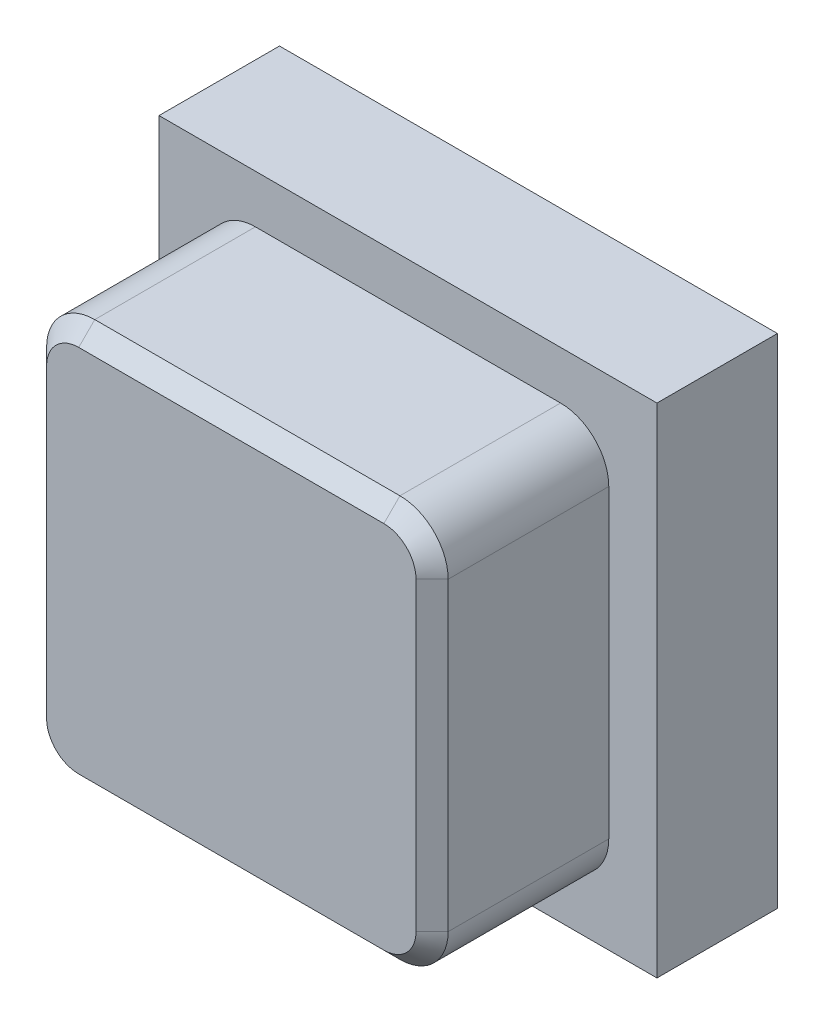
ISO-10303-21;
HEADER;
FILE_DESCRIPTION(('STEP AP214'),'2;1');
FILE_NAME('part.step','',(''),(''),'','','');
FILE_SCHEMA(('AUTOMOTIVE_DESIGN { 1 0 10303 214 1 1 1 1 }'));
ENDSEC;
DATA;
#1=APPLICATION_CONTEXT('core data for automotive mechanical design processes');
#2=APPLICATION_PROTOCOL_DEFINITION('international standard','automotive_design',2000,#1);
#3=PRODUCT_CONTEXT('',#1,'mechanical');
#4=PRODUCT('Part','Part','',(#3));
#5=PRODUCT_RELATED_PRODUCT_CATEGORY('part','',(#4));
#6=PRODUCT_DEFINITION_FORMATION('','',#4);
#7=PRODUCT_DEFINITION_CONTEXT('part definition',#1,'design');
#8=PRODUCT_DEFINITION('design','',#6,#7);
#9=PRODUCT_DEFINITION_SHAPE('','',#8);
#10=(LENGTH_UNIT() NAMED_UNIT(*) SI_UNIT(.MILLI.,.METRE.));
#11=(NAMED_UNIT(*) PLANE_ANGLE_UNIT() SI_UNIT($,.RADIAN.));
#12=(NAMED_UNIT(*) SI_UNIT($,.STERADIAN.) SOLID_ANGLE_UNIT());
#13=UNCERTAINTY_MEASURE_WITH_UNIT(LENGTH_MEASURE(1.E-05),#10,'distance_accuracy_value','');
#14=(GEOMETRIC_REPRESENTATION_CONTEXT(3) GLOBAL_UNCERTAINTY_ASSIGNED_CONTEXT((#13)) GLOBAL_UNIT_ASSIGNED_CONTEXT((#10,
#11,#12)) REPRESENTATION_CONTEXT('',''));
#15=CARTESIAN_POINT('',(0.,0.,0.));
#16=DIRECTION('',(0.,0.,1.));
#17=DIRECTION('',(1.,0.,0.));
#18=AXIS2_PLACEMENT_3D('',#15,#16,#17);
#19=CARTESIAN_POINT('',(0.,0.,4.4));
#20=DIRECTION('',(1.,0.,0.));
#21=DIRECTION('',(0.,0.,-1.));
#22=AXIS2_PLACEMENT_3D('',#19,#20,#21);
#23=PLANE('',#22);
#24=DIRECTION('',(0.,0.,-1.));
#25=VECTOR('',#24,1.);
#26=CARTESIAN_POINT('',(0.,-8.8,4.4));
#27=LINE('',#26,#25);
#28=CARTESIAN_POINT('',(0.,-8.8,0.));
#29=VERTEX_POINT('',#28);
#30=CARTESIAN_POINT('',(0.,-8.8,4.));
#31=VERTEX_POINT('',#30);
#32=EDGE_CURVE('E200',#29,#31,#27,.F.);
#33=ORIENTED_EDGE('',*,*,#32,.T.);
#34=DIRECTION('',(0.,1.,0.));
#35=VECTOR('',#34,1.);
#36=CARTESIAN_POINT('',(0.,-1.2,4.));
#37=LINE('',#36,#35);
#38=CARTESIAN_POINT('',(0.,-1.2,4.));
#39=VERTEX_POINT('',#38);
#40=EDGE_CURVE('E235',#31,#39,#37,.T.);
#41=ORIENTED_EDGE('',*,*,#40,.T.);
#42=DIRECTION('',(0.,0.,-1.));
#43=VECTOR('',#42,1.);
#44=CARTESIAN_POINT('',(0.,-1.2,4.4));
#45=LINE('',#44,#43);
#46=CARTESIAN_POINT('',(0.,-1.2,0.));
#47=VERTEX_POINT('',#46);
#48=EDGE_CURVE('E203',#39,#47,#45,.T.);
#49=ORIENTED_EDGE('',*,*,#48,.T.);
#50=DIRECTION('',(0.,-1.,0.));
#51=VECTOR('',#50,1.);
#52=CARTESIAN_POINT('',(0.,0.,0.));
#53=LINE('',#52,#51);
#54=EDGE_CURVE('E174',#47,#29,#53,.T.);
#55=ORIENTED_EDGE('',*,*,#54,.T.);
#56=EDGE_LOOP('',(#33,#41,#49,#55));
#57=FACE_BOUND('',#56,.T.);
#58=ADVANCED_FACE('F34',(#57),#23,.F.);
#59=CARTESIAN_POINT('',(0.,-10.,4.4));
#60=DIRECTION('',(0.,1.,0.));
#61=DIRECTION('',(0.,0.,1.));
#62=AXIS2_PLACEMENT_3D('',#59,#60,#61);
#63=PLANE('',#62);
#64=DIRECTION('',(0.,0.,-1.));
#65=VECTOR('',#64,1.);
#66=CARTESIAN_POINT('',(8.8,-10.,4.4));
#67=LINE('',#66,#65);
#68=CARTESIAN_POINT('',(8.8,-10.,0.));
#69=VERTEX_POINT('',#68);
#70=CARTESIAN_POINT('',(8.8,-10.,4.));
#71=VERTEX_POINT('',#70);
#72=EDGE_CURVE('E205',#69,#71,#67,.F.);
#73=ORIENTED_EDGE('',*,*,#72,.T.);
#74=DIRECTION('',(-1.,0.,0.));
#75=VECTOR('',#74,1.);
#76=CARTESIAN_POINT('',(1.2,-10.,4.));
#77=LINE('',#76,#75);
#78=CARTESIAN_POINT('',(1.2,-10.,4.));
#79=VERTEX_POINT('',#78);
#80=EDGE_CURVE('E242',#71,#79,#77,.T.);
#81=ORIENTED_EDGE('',*,*,#80,.T.);
#82=DIRECTION('',(0.,0.,-1.));
#83=VECTOR('',#82,1.);
#84=CARTESIAN_POINT('',(1.2,-10.,4.4));
#85=LINE('',#84,#83);
#86=CARTESIAN_POINT('',(1.2,-10.,0.));
#87=VERTEX_POINT('',#86);
#88=EDGE_CURVE('E208',#79,#87,#85,.T.);
#89=ORIENTED_EDGE('',*,*,#88,.T.);
#90=DIRECTION('',(1.,0.,0.));
#91=VECTOR('',#90,1.);
#92=CARTESIAN_POINT('',(0.,-10.,0.));
#93=LINE('',#92,#91);
#94=EDGE_CURVE('E177',#87,#69,#93,.T.);
#95=ORIENTED_EDGE('',*,*,#94,.T.);
#96=EDGE_LOOP('',(#73,#81,#89,#95));
#97=FACE_BOUND('',#96,.T.);
#98=ADVANCED_FACE('F289',(#97),#63,.F.);
#99=CARTESIAN_POINT('',(10.,0.,4.4));
#100=DIRECTION('',(-1.,0.,0.));
#101=DIRECTION('',(0.,0.,1.));
#102=AXIS2_PLACEMENT_3D('',#99,#100,#101);
#103=PLANE('',#102);
#104=DIRECTION('',(0.,0.,-1.));
#105=VECTOR('',#104,1.);
#106=CARTESIAN_POINT('',(10.,-1.2,4.4));
#107=LINE('',#106,#105);
#108=CARTESIAN_POINT('',(10.,-1.2,0.));
#109=VERTEX_POINT('',#108);
#110=CARTESIAN_POINT('',(10.,-1.2,4.));
#111=VERTEX_POINT('',#110);
#112=EDGE_CURVE('E198',#109,#111,#107,.F.);
#113=ORIENTED_EDGE('',*,*,#112,.T.);
#114=DIRECTION('',(0.,-1.,0.));
#115=VECTOR('',#114,1.);
#116=CARTESIAN_POINT('',(10.,-8.8,4.));
#117=LINE('',#116,#115);
#118=CARTESIAN_POINT('',(10.,-8.8,4.));
#119=VERTEX_POINT('',#118);
#120=EDGE_CURVE('E56',#111,#119,#117,.T.);
#121=ORIENTED_EDGE('',*,*,#120,.T.);
#122=DIRECTION('',(0.,0.,-1.));
#123=VECTOR('',#122,1.);
#124=CARTESIAN_POINT('',(10.,-8.8,4.4));
#125=LINE('',#124,#123);
#126=CARTESIAN_POINT('',(10.,-8.8,0.));
#127=VERTEX_POINT('',#126);
#128=EDGE_CURVE('E196',#119,#127,#125,.T.);
#129=ORIENTED_EDGE('',*,*,#128,.T.);
#130=DIRECTION('',(0.,1.,0.));
#131=VECTOR('',#130,1.);
#132=CARTESIAN_POINT('',(10.,0.,0.));
#133=LINE('',#132,#131);
#134=EDGE_CURVE('E185',#127,#109,#133,.T.);
#135=ORIENTED_EDGE('',*,*,#134,.T.);
#136=EDGE_LOOP('',(#113,#121,#129,#135));
#137=FACE_BOUND('',#136,.T.);
#138=ADVANCED_FACE('F295',(#137),#103,.F.);
#139=CARTESIAN_POINT('',(0.,0.,4.4));
#140=DIRECTION('',(0.,-1.,0.));
#141=DIRECTION('',(0.,0.,-1.));
#142=AXIS2_PLACEMENT_3D('',#139,#140,#141);
#143=PLANE('',#142);
#144=DIRECTION('',(0.,0.,-1.));
#145=VECTOR('',#144,1.);
#146=CARTESIAN_POINT('',(1.2,0.,4.4));
#147=LINE('',#146,#145);
#148=CARTESIAN_POINT('',(1.2,0.,0.));
#149=VERTEX_POINT('',#148);
#150=CARTESIAN_POINT('',(1.2,0.,4.));
#151=VERTEX_POINT('',#150);
#152=EDGE_CURVE('E191',#149,#151,#147,.F.);
#153=ORIENTED_EDGE('',*,*,#152,.T.);
#154=DIRECTION('',(1.,0.,0.));
#155=VECTOR('',#154,1.);
#156=CARTESIAN_POINT('',(8.8,0.,4.));
#157=LINE('',#156,#155);
#158=CARTESIAN_POINT('',(8.8,0.,4.));
#159=VERTEX_POINT('',#158);
#160=EDGE_CURVE('E244',#151,#159,#157,.T.);
#161=ORIENTED_EDGE('',*,*,#160,.T.);
#162=DIRECTION('',(0.,0.,-1.));
#163=VECTOR('',#162,1.);
#164=CARTESIAN_POINT('',(8.8,0.,4.4));
#165=LINE('',#164,#163);
#166=CARTESIAN_POINT('',(8.8,0.,0.));
#167=VERTEX_POINT('',#166);
#168=EDGE_CURVE('E194',#159,#167,#165,.T.);
#169=ORIENTED_EDGE('',*,*,#168,.T.);
#170=DIRECTION('',(-1.,0.,0.));
#171=VECTOR('',#170,1.);
#172=CARTESIAN_POINT('',(0.,0.,0.));
#173=LINE('',#172,#171);
#174=EDGE_CURVE('E188',#167,#149,#173,.T.);
#175=ORIENTED_EDGE('',*,*,#174,.T.);
#176=EDGE_LOOP('',(#153,#161,#169,#175));
#177=FACE_BOUND('',#176,.T.);
#178=ADVANCED_FACE('F365',(#177),#143,.F.);
#179=CARTESIAN_POINT('',(0.,0.,4.4));
#180=DIRECTION('',(0.,0.,1.));
#181=DIRECTION('',(1.,0.,0.));
#182=AXIS2_PLACEMENT_3D('',#179,#180,#181);
#183=PLANE('',#182);
#184=CARTESIAN_POINT('',(1.2,-1.2,4.4));
#185=DIRECTION('',(0.,0.,1.));
#186=DIRECTION('',(1.,0.,0.));
#187=AXIS2_PLACEMENT_3D('',#184,#185,#186);
#188=CIRCLE('',#187,0.800000000000001);
#189=CARTESIAN_POINT('',(1.2,-0.399999999999999,4.4));
#190=VERTEX_POINT('',#189);
#191=CARTESIAN_POINT('',(0.399999999999999,-1.2,4.4));
#192=VERTEX_POINT('',#191);
#193=EDGE_CURVE('E228',#190,#192,#188,.T.);
#194=ORIENTED_EDGE('',*,*,#193,.T.);
#195=DIRECTION('',(0.,-1.,0.));
#196=VECTOR('',#195,1.);
#197=CARTESIAN_POINT('',(0.399999999999999,-8.8,4.4));
#198=LINE('',#197,#196);
#199=CARTESIAN_POINT('',(0.4,-8.8,4.4));
#200=VERTEX_POINT('',#199);
#201=EDGE_CURVE('E232',#192,#200,#198,.T.);
#202=ORIENTED_EDGE('',*,*,#201,.T.);
#203=CARTESIAN_POINT('',(1.2,-8.8,4.4));
#204=DIRECTION('',(0.,0.,1.));
#205=DIRECTION('',(1.,0.,0.));
#206=AXIS2_PLACEMENT_3D('',#203,#204,#205);
#207=CIRCLE('',#206,0.8);
#208=CARTESIAN_POINT('',(1.2,-9.6,4.4));
#209=VERTEX_POINT('',#208);
#210=EDGE_CURVE('E230',#200,#209,#207,.T.);
#211=ORIENTED_EDGE('',*,*,#210,.T.);
#212=DIRECTION('',(1.,0.,0.));
#213=VECTOR('',#212,1.);
#214=CARTESIAN_POINT('',(8.8,-9.6,4.4));
#215=LINE('',#214,#213);
#216=CARTESIAN_POINT('',(8.8,-9.6,4.4));
#217=VERTEX_POINT('',#216);
#218=EDGE_CURVE('E226',#209,#217,#215,.T.);
#219=ORIENTED_EDGE('',*,*,#218,.T.);
#220=CARTESIAN_POINT('',(8.8,-8.8,4.4));
#221=DIRECTION('',(0.,0.,1.));
#222=DIRECTION('',(1.,0.,0.));
#223=AXIS2_PLACEMENT_3D('',#220,#221,#222);
#224=CIRCLE('',#223,0.8);
#225=CARTESIAN_POINT('',(9.6,-8.8,4.4));
#226=VERTEX_POINT('',#225);
#227=EDGE_CURVE('E222',#217,#226,#224,.T.);
#228=ORIENTED_EDGE('',*,*,#227,.T.);
#229=DIRECTION('',(0.,1.,0.));
#230=VECTOR('',#229,1.);
#231=CARTESIAN_POINT('',(9.6,-1.2,4.4));
#232=LINE('',#231,#230);
#233=CARTESIAN_POINT('',(9.6,-1.2,4.4));
#234=VERTEX_POINT('',#233);
#235=EDGE_CURVE('E218',#226,#234,#232,.T.);
#236=ORIENTED_EDGE('',*,*,#235,.T.);
#237=CARTESIAN_POINT('',(8.8,-1.2,4.4));
#238=DIRECTION('',(0.,0.,1.));
#239=DIRECTION('',(1.,0.,0.));
#240=AXIS2_PLACEMENT_3D('',#237,#238,#239);
#241=CIRCLE('',#240,0.8);
#242=CARTESIAN_POINT('',(8.8,-0.4,4.4));
#243=VERTEX_POINT('',#242);
#244=EDGE_CURVE('E220',#234,#243,#241,.T.);
#245=ORIENTED_EDGE('',*,*,#244,.T.);
#246=DIRECTION('',(-1.,0.,0.));
#247=VECTOR('',#246,1.);
#248=CARTESIAN_POINT('',(1.2,-0.399999999999999,4.4));
#249=LINE('',#248,#247);
#250=EDGE_CURVE('E224',#243,#190,#249,.T.);
#251=ORIENTED_EDGE('',*,*,#250,.T.);
#252=EDGE_LOOP('',(#194,#202,#211,#219,#228,#236,#245,#251));
#253=FACE_BOUND('',#252,.T.);
#254=ADVANCED_FACE('F381',(#253),#183,.T.);
#255=CARTESIAN_POINT('',(11.2,-11.2,-3.));
#256=DIRECTION('',(0.,1.,0.));
#257=DIRECTION('',(0.,0.,1.));
#258=AXIS2_PLACEMENT_3D('',#255,#256,#257);
#259=PLANE('',#258);
#260=DIRECTION('',(-1.,0.,0.));
#261=VECTOR('',#260,1.);
#262=CARTESIAN_POINT('',(11.2,-11.2,0.));
#263=LINE('',#262,#261);
#264=CARTESIAN_POINT('',(11.2,-11.2,0.));
#265=VERTEX_POINT('',#264);
#266=CARTESIAN_POINT('',(-1.2,-11.2,0.));
#267=VERTEX_POINT('',#266);
#268=EDGE_CURVE('E173',#265,#267,#263,.T.);
#269=ORIENTED_EDGE('',*,*,#268,.T.);
#270=DIRECTION('',(0.,0.,1.));
#271=VECTOR('',#270,1.);
#272=CARTESIAN_POINT('',(-1.2,-11.2,-3.));
#273=LINE('',#272,#271);
#274=CARTESIAN_POINT('',(-1.2,-11.2,-3.));
#275=VERTEX_POINT('',#274);
#276=EDGE_CURVE('E153',#275,#267,#273,.T.);
#277=ORIENTED_EDGE('',*,*,#276,.F.);
#278=DIRECTION('',(-1.,0.,0.));
#279=VECTOR('',#278,1.);
#280=CARTESIAN_POINT('',(11.2,-11.2,-3.));
#281=LINE('',#280,#279);
#282=CARTESIAN_POINT('',(11.2,-11.2,-3.));
#283=VERTEX_POINT('',#282);
#284=EDGE_CURVE('E160',#283,#275,#281,.T.);
#285=ORIENTED_EDGE('',*,*,#284,.F.);
#286=DIRECTION('',(0.,0.,1.));
#287=VECTOR('',#286,1.);
#288=CARTESIAN_POINT('',(11.2,-11.2,-3.));
#289=LINE('',#288,#287);
#290=EDGE_CURVE('E569',#283,#265,#289,.T.);
#291=ORIENTED_EDGE('',*,*,#290,.T.);
#292=EDGE_LOOP('',(#269,#277,#285,#291));
#293=FACE_BOUND('',#292,.T.);
#294=ADVANCED_FACE('F171',(#293),#259,.F.);
#295=CARTESIAN_POINT('',(-1.2,-11.2,-3.));
#296=DIRECTION('',(1.,0.,0.));
#297=DIRECTION('',(0.,0.,-1.));
#298=AXIS2_PLACEMENT_3D('',#295,#296,#297);
#299=PLANE('',#298);
#300=DIRECTION('',(0.,1.,0.));
#301=VECTOR('',#300,1.);
#302=CARTESIAN_POINT('',(-1.2,-11.2,0.));
#303=LINE('',#302,#301);
#304=CARTESIAN_POINT('',(-1.2,1.2,0.));
#305=VERTEX_POINT('',#304);
#306=EDGE_CURVE('E567',#267,#305,#303,.T.);
#307=ORIENTED_EDGE('',*,*,#306,.T.);
#308=DIRECTION('',(0.,0.,1.));
#309=VECTOR('',#308,1.);
#310=CARTESIAN_POINT('',(-1.2,1.2,-3.));
#311=LINE('',#310,#309);
#312=CARTESIAN_POINT('',(-1.2,1.2,-3.));
#313=VERTEX_POINT('',#312);
#314=EDGE_CURVE('E156',#313,#305,#311,.T.);
#315=ORIENTED_EDGE('',*,*,#314,.F.);
#316=DIRECTION('',(0.,1.,0.));
#317=VECTOR('',#316,1.);
#318=CARTESIAN_POINT('',(-1.2,-11.2,-3.));
#319=LINE('',#318,#317);
#320=EDGE_CURVE('E149',#275,#313,#319,.T.);
#321=ORIENTED_EDGE('',*,*,#320,.F.);
#322=ORIENTED_EDGE('',*,*,#276,.T.);
#323=EDGE_LOOP('',(#307,#315,#321,#322));
#324=FACE_BOUND('',#323,.T.);
#325=ADVANCED_FACE('F151',(#324),#299,.F.);
#326=CARTESIAN_POINT('',(-1.2,1.2,-3.));
#327=DIRECTION('',(0.,-1.,0.));
#328=DIRECTION('',(0.,0.,-1.));
#329=AXIS2_PLACEMENT_3D('',#326,#327,#328);
#330=PLANE('',#329);
#331=DIRECTION('',(1.,0.,0.));
#332=VECTOR('',#331,1.);
#333=CARTESIAN_POINT('',(-1.2,1.2,0.));
#334=LINE('',#333,#332);
#335=CARTESIAN_POINT('',(11.2,1.2,0.));
#336=VERTEX_POINT('',#335);
#337=EDGE_CURVE('E564',#305,#336,#334,.T.);
#338=ORIENTED_EDGE('',*,*,#337,.T.);
#339=DIRECTION('',(0.,0.,1.));
#340=VECTOR('',#339,1.);
#341=CARTESIAN_POINT('',(11.2,1.2,-3.));
#342=LINE('',#341,#340);
#343=CARTESIAN_POINT('',(11.2,1.2,-3.));
#344=VERTEX_POINT('',#343);
#345=EDGE_CURVE('E179',#344,#336,#342,.T.);
#346=ORIENTED_EDGE('',*,*,#345,.F.);
#347=DIRECTION('',(1.,0.,0.));
#348=VECTOR('',#347,1.);
#349=CARTESIAN_POINT('',(-1.2,1.2,-3.));
#350=LINE('',#349,#348);
#351=EDGE_CURVE('E159',#313,#344,#350,.T.);
#352=ORIENTED_EDGE('',*,*,#351,.F.);
#353=ORIENTED_EDGE('',*,*,#314,.T.);
#354=EDGE_LOOP('',(#338,#346,#352,#353));
#355=FACE_BOUND('',#354,.T.);
#356=ADVANCED_FACE('F538',(#355),#330,.F.);
#357=CARTESIAN_POINT('',(11.2,1.2,-3.));
#358=DIRECTION('',(-1.,0.,0.));
#359=DIRECTION('',(0.,0.,1.));
#360=AXIS2_PLACEMENT_3D('',#357,#358,#359);
#361=PLANE('',#360);
#362=DIRECTION('',(0.,-1.,0.));
#363=VECTOR('',#362,1.);
#364=CARTESIAN_POINT('',(11.2,1.2,0.));
#365=LINE('',#364,#363);
#366=EDGE_CURVE('E169',#336,#265,#365,.T.);
#367=ORIENTED_EDGE('',*,*,#366,.T.);
#368=ORIENTED_EDGE('',*,*,#290,.F.);
#369=DIRECTION('',(0.,-1.,0.));
#370=VECTOR('',#369,1.);
#371=CARTESIAN_POINT('',(11.2,1.2,-3.));
#372=LINE('',#371,#370);
#373=EDGE_CURVE('E165',#344,#283,#372,.T.);
#374=ORIENTED_EDGE('',*,*,#373,.F.);
#375=ORIENTED_EDGE('',*,*,#345,.T.);
#376=EDGE_LOOP('',(#367,#368,#374,#375));
#377=FACE_BOUND('',#376,.T.);
#378=ADVANCED_FACE('F490',(#377),#361,.F.);
#379=CARTESIAN_POINT('',(0.,0.,-3.));
#380=DIRECTION('',(0.,0.,-1.));
#381=DIRECTION('',(-1.,0.,0.));
#382=AXIS2_PLACEMENT_3D('',#379,#380,#381);
#383=PLANE('',#382);
#384=CARTESIAN_POINT('',(5.,-5.,-3.));
#385=DIRECTION('',(0.,0.,-1.));
#386=DIRECTION('',(-1.,0.,0.));
#387=AXIS2_PLACEMENT_3D('',#384,#385,#386);
#388=CIRCLE('',#387,2.20000000000001);
#389=CARTESIAN_POINT('',(2.8,-5.,-3.));
#390=VERTEX_POINT('',#389);
#391=EDGE_CURVE('E11',#390,#390,#388,.F.);
#392=ORIENTED_EDGE('',*,*,#391,.T.);
#393=EDGE_LOOP('',(#392));
#394=FACE_BOUND('',#393,.T.);
#395=ORIENTED_EDGE('',*,*,#284,.T.);
#396=ORIENTED_EDGE('',*,*,#320,.T.);
#397=ORIENTED_EDGE('',*,*,#351,.T.);
#398=ORIENTED_EDGE('',*,*,#373,.T.);
#399=EDGE_LOOP('',(#395,#396,#397,#398));
#400=FACE_BOUND('',#399,.T.);
#401=ADVANCED_FACE('F163',(#394,#400),#383,.T.);
#402=CARTESIAN_POINT('',(0.,0.,0.));
#403=DIRECTION('',(0.,0.,-1.));
#404=DIRECTION('',(-1.,0.,0.));
#405=AXIS2_PLACEMENT_3D('',#402,#403,#404);
#406=PLANE('',#405);
#407=ORIENTED_EDGE('',*,*,#54,.F.);
#408=CARTESIAN_POINT('',(1.2,-1.2,0.));
#409=DIRECTION('',(0.,0.,-1.));
#410=DIRECTION('',(-1.,0.,0.));
#411=AXIS2_PLACEMENT_3D('',#408,#409,#410);
#412=CIRCLE('',#411,1.2);
#413=EDGE_CURVE('E212',#47,#149,#412,.T.);
#414=ORIENTED_EDGE('',*,*,#413,.T.);
#415=ORIENTED_EDGE('',*,*,#174,.F.);
#416=CARTESIAN_POINT('',(8.8,-1.2,0.));
#417=DIRECTION('',(0.,0.,-1.));
#418=DIRECTION('',(-1.,0.,0.));
#419=AXIS2_PLACEMENT_3D('',#416,#417,#418);
#420=CIRCLE('',#419,1.2);
#421=EDGE_CURVE('E210',#167,#109,#420,.T.);
#422=ORIENTED_EDGE('',*,*,#421,.T.);
#423=ORIENTED_EDGE('',*,*,#134,.F.);
#424=CARTESIAN_POINT('',(8.8,-8.8,0.));
#425=DIRECTION('',(0.,0.,-1.));
#426=DIRECTION('',(-1.,0.,0.));
#427=AXIS2_PLACEMENT_3D('',#424,#425,#426);
#428=CIRCLE('',#427,1.2);
#429=EDGE_CURVE('E216',#127,#69,#428,.T.);
#430=ORIENTED_EDGE('',*,*,#429,.T.);
#431=ORIENTED_EDGE('',*,*,#94,.F.);
#432=CARTESIAN_POINT('',(1.2,-8.8,0.));
#433=DIRECTION('',(0.,0.,-1.));
#434=DIRECTION('',(-1.,0.,0.));
#435=AXIS2_PLACEMENT_3D('',#432,#433,#434);
#436=CIRCLE('',#435,1.2);
#437=EDGE_CURVE('E214',#87,#29,#436,.T.);
#438=ORIENTED_EDGE('',*,*,#437,.T.);
#439=EDGE_LOOP('',(#407,#414,#415,#422,#423,#430,#431,#438));
#440=FACE_BOUND('',#439,.T.);
#441=ORIENTED_EDGE('',*,*,#268,.F.);
#442=ORIENTED_EDGE('',*,*,#366,.F.);
#443=ORIENTED_EDGE('',*,*,#337,.F.);
#444=ORIENTED_EDGE('',*,*,#306,.F.);
#445=EDGE_LOOP('',(#441,#442,#443,#444));
#446=FACE_BOUND('',#445,.T.);
#447=ADVANCED_FACE('F357',(#440,#446),#406,.F.);
#448=CARTESIAN_POINT('',(5.,-5.,5.09116882454314));
#449=DIRECTION('',(0.,0.,-1.));
#450=DIRECTION('',(-1.,0.,0.));
#451=AXIS2_PLACEMENT_3D('',#448,#449,#450);
#452=CYLINDRICAL_SURFACE('',#451,1.8);
#453=CARTESIAN_POINT('',(5.,-5.,-2.59999999999999));
#454=DIRECTION('',(0.,0.,-1.));
#455=DIRECTION('',(-1.,0.,0.));
#456=AXIS2_PLACEMENT_3D('',#453,#454,#455);
#457=CIRCLE('',#456,1.8);
#458=CARTESIAN_POINT('',(3.2,-5.,-2.59999999999999));
#459=VERTEX_POINT('',#458);
#460=EDGE_CURVE('E42',#459,#459,#457,.T.);
#461=ORIENTED_EDGE('',*,*,#460,.T.);
#462=EDGE_LOOP('',(#461));
#463=FACE_BOUND('',#462,.T.);
#464=CARTESIAN_POINT('',(5.,-5.,0.));
#465=DIRECTION('',(0.,0.,-1.));
#466=DIRECTION('',(-1.,0.,0.));
#467=AXIS2_PLACEMENT_3D('',#464,#465,#466);
#468=CIRCLE('',#467,1.8);
#469=CARTESIAN_POINT('',(3.2,-5.,0.));
#470=VERTEX_POINT('',#469);
#471=EDGE_CURVE('E271',#470,#470,#468,.F.);
#472=ORIENTED_EDGE('',*,*,#471,.T.);
#473=EDGE_LOOP('',(#472));
#474=FACE_BOUND('',#473,.T.);
#475=ADVANCED_FACE('F275',(#463,#474),#452,.F.);
#476=CARTESIAN_POINT('',(0.,0.,0.));
#477=DIRECTION('',(0.,0.,-1.));
#478=DIRECTION('',(-1.,0.,0.));
#479=AXIS2_PLACEMENT_3D('',#476,#477,#478);
#480=PLANE('',#479);
#481=ORIENTED_EDGE('',*,*,#471,.F.);
#482=EDGE_LOOP('',(#481));
#483=FACE_BOUND('',#482,.T.);
#484=ADVANCED_FACE('F304',(#483),#480,.T.);
#485=CARTESIAN_POINT('',(8.8,-1.2,4.4));
#486=DIRECTION('',(0.,0.,-1.));
#487=DIRECTION('',(-1.,0.,0.));
#488=AXIS2_PLACEMENT_3D('',#485,#486,#487);
#489=CYLINDRICAL_SURFACE('',#488,1.2);
#490=ORIENTED_EDGE('',*,*,#168,.F.);
#491=CARTESIAN_POINT('',(8.8,-1.2,4.));
#492=DIRECTION('',(0.,0.,1.));
#493=DIRECTION('',(1.,0.,0.));
#494=AXIS2_PLACEMENT_3D('',#491,#492,#493);
#495=CIRCLE('',#494,1.2);
#496=EDGE_CURVE('E49',#159,#111,#495,.F.);
#497=ORIENTED_EDGE('',*,*,#496,.T.);
#498=ORIENTED_EDGE('',*,*,#112,.F.);
#499=ORIENTED_EDGE('',*,*,#421,.F.);
#500=EDGE_LOOP('',(#490,#497,#498,#499));
#501=FACE_BOUND('',#500,.T.);
#502=ADVANCED_FACE('F300',(#501),#489,.T.);
#503=CARTESIAN_POINT('',(1.2,-1.2,4.4));
#504=DIRECTION('',(0.,0.,-1.));
#505=DIRECTION('',(-1.,0.,0.));
#506=AXIS2_PLACEMENT_3D('',#503,#504,#505);
#507=CYLINDRICAL_SURFACE('',#506,1.2);
#508=ORIENTED_EDGE('',*,*,#48,.F.);
#509=CARTESIAN_POINT('',(1.2,-1.2,4.));
#510=DIRECTION('',(0.,0.,1.));
#511=DIRECTION('',(1.,0.,0.));
#512=AXIS2_PLACEMENT_3D('',#509,#510,#511);
#513=CIRCLE('',#512,1.2);
#514=EDGE_CURVE('E240',#39,#151,#513,.F.);
#515=ORIENTED_EDGE('',*,*,#514,.T.);
#516=ORIENTED_EDGE('',*,*,#152,.F.);
#517=ORIENTED_EDGE('',*,*,#413,.F.);
#518=EDGE_LOOP('',(#508,#515,#516,#517));
#519=FACE_BOUND('',#518,.T.);
#520=ADVANCED_FACE('F303',(#519),#507,.T.);
#521=CARTESIAN_POINT('',(1.2,-8.8,4.4));
#522=DIRECTION('',(0.,0.,-1.));
#523=DIRECTION('',(-1.,0.,0.));
#524=AXIS2_PLACEMENT_3D('',#521,#522,#523);
#525=CYLINDRICAL_SURFACE('',#524,1.2);
#526=ORIENTED_EDGE('',*,*,#88,.F.);
#527=CARTESIAN_POINT('',(1.2,-8.8,4.));
#528=DIRECTION('',(0.,0.,1.));
#529=DIRECTION('',(1.,0.,0.));
#530=AXIS2_PLACEMENT_3D('',#527,#528,#529);
#531=CIRCLE('',#530,1.2);
#532=EDGE_CURVE('E238',#79,#31,#531,.F.);
#533=ORIENTED_EDGE('',*,*,#532,.T.);
#534=ORIENTED_EDGE('',*,*,#32,.F.);
#535=ORIENTED_EDGE('',*,*,#437,.F.);
#536=EDGE_LOOP('',(#526,#533,#534,#535));
#537=FACE_BOUND('',#536,.T.);
#538=ADVANCED_FACE('F307',(#537),#525,.T.);
#539=CARTESIAN_POINT('',(8.8,-8.8,4.4));
#540=DIRECTION('',(0.,0.,-1.));
#541=DIRECTION('',(-1.,0.,0.));
#542=AXIS2_PLACEMENT_3D('',#539,#540,#541);
#543=CYLINDRICAL_SURFACE('',#542,1.2);
#544=ORIENTED_EDGE('',*,*,#128,.F.);
#545=CARTESIAN_POINT('',(8.8,-8.8,4.));
#546=DIRECTION('',(0.,0.,1.));
#547=DIRECTION('',(1.,0.,0.));
#548=AXIS2_PLACEMENT_3D('',#545,#546,#547);
#549=CIRCLE('',#548,1.2);
#550=EDGE_CURVE('E246',#119,#71,#549,.F.);
#551=ORIENTED_EDGE('',*,*,#550,.T.);
#552=ORIENTED_EDGE('',*,*,#72,.F.);
#553=ORIENTED_EDGE('',*,*,#429,.F.);
#554=EDGE_LOOP('',(#544,#551,#552,#553));
#555=FACE_BOUND('',#554,.T.);
#556=ADVANCED_FACE('F311',(#555),#543,.T.);
#557=CARTESIAN_POINT('',(9.6,0.,4.4));
#558=DIRECTION('',(0.707106781186549,0.,0.707106781186546));
#559=DIRECTION('',(0.,-1.,0.));
#560=AXIS2_PLACEMENT_3D('',#557,#558,#559);
#561=PLANE('',#560);
#562=DIRECTION('',(-0.707106781186546,0.,0.707106781186549));
#563=VECTOR('',#562,1.);
#564=CARTESIAN_POINT('',(10.,-8.8,4.));
#565=LINE('',#564,#563);
#566=EDGE_CURVE('E266',#119,#226,#565,.T.);
#567=ORIENTED_EDGE('',*,*,#566,.F.);
#568=ORIENTED_EDGE('',*,*,#120,.F.);
#569=DIRECTION('',(0.707106781186546,0.,-0.707106781186549));
#570=VECTOR('',#569,1.);
#571=CARTESIAN_POINT('',(9.6,-1.2,4.4));
#572=LINE('',#571,#570);
#573=EDGE_CURVE('E269',#234,#111,#572,.T.);
#574=ORIENTED_EDGE('',*,*,#573,.F.);
#575=ORIENTED_EDGE('',*,*,#235,.F.);
#576=EDGE_LOOP('',(#567,#568,#574,#575));
#577=FACE_BOUND('',#576,.T.);
#578=ADVANCED_FACE('F314',(#577),#561,.T.);
#579=CARTESIAN_POINT('',(8.8,-1.2,4.4));
#580=DIRECTION('',(0.,0.,-1.));
#581=DIRECTION('',(-1.,0.,0.));
#582=AXIS2_PLACEMENT_3D('',#579,#580,#581);
#583=CONICAL_SURFACE('',#582,0.8,0.785398163397446);
#584=ORIENTED_EDGE('',*,*,#573,.T.);
#585=ORIENTED_EDGE('',*,*,#496,.F.);
#586=DIRECTION('',(0.,0.707106781186546,-0.707106781186549));
#587=VECTOR('',#586,1.);
#588=CARTESIAN_POINT('',(8.8,-0.4,4.4));
#589=LINE('',#588,#587);
#590=EDGE_CURVE('E263',#243,#159,#589,.T.);
#591=ORIENTED_EDGE('',*,*,#590,.F.);
#592=ORIENTED_EDGE('',*,*,#244,.F.);
#593=EDGE_LOOP('',(#584,#585,#591,#592));
#594=FACE_BOUND('',#593,.T.);
#595=ADVANCED_FACE('F335',(#594),#583,.T.);
#596=CARTESIAN_POINT('',(8.8,-8.8,4.4));
#597=DIRECTION('',(0.,0.,-1.));
#598=DIRECTION('',(-1.,0.,0.));
#599=AXIS2_PLACEMENT_3D('',#596,#597,#598);
#600=CONICAL_SURFACE('',#599,0.8,0.785398163397446);
#601=ORIENTED_EDGE('',*,*,#566,.T.);
#602=ORIENTED_EDGE('',*,*,#227,.F.);
#603=DIRECTION('',(0.,0.707106781186546,0.707106781186549));
#604=VECTOR('',#603,1.);
#605=CARTESIAN_POINT('',(8.8,-10.,4.));
#606=LINE('',#605,#604);
#607=EDGE_CURVE('E260',#71,#217,#606,.T.);
#608=ORIENTED_EDGE('',*,*,#607,.F.);
#609=ORIENTED_EDGE('',*,*,#550,.F.);
#610=EDGE_LOOP('',(#601,#602,#608,#609));
#611=FACE_BOUND('',#610,.T.);
#612=ADVANCED_FACE('F331',(#611),#600,.T.);
#613=CARTESIAN_POINT('',(0.,-0.399999999999999,4.4));
#614=DIRECTION('',(0.,0.707106781186549,0.707106781186546));
#615=DIRECTION('',(1.,0.,0.));
#616=AXIS2_PLACEMENT_3D('',#613,#614,#615);
#617=PLANE('',#616);
#618=ORIENTED_EDGE('',*,*,#590,.T.);
#619=ORIENTED_EDGE('',*,*,#160,.F.);
#620=DIRECTION('',(0.,0.707106781186546,-0.707106781186549));
#621=VECTOR('',#620,1.);
#622=CARTESIAN_POINT('',(1.2,-0.399999999999999,4.4));
#623=LINE('',#622,#621);
#624=EDGE_CURVE('E257',#190,#151,#623,.T.);
#625=ORIENTED_EDGE('',*,*,#624,.F.);
#626=ORIENTED_EDGE('',*,*,#250,.F.);
#627=EDGE_LOOP('',(#618,#619,#625,#626));
#628=FACE_BOUND('',#627,.T.);
#629=ADVANCED_FACE('F327',(#628),#617,.T.);
#630=CARTESIAN_POINT('',(0.,-9.6,4.4));
#631=DIRECTION('',(0.,-0.707106781186549,0.707106781186546));
#632=DIRECTION('',(-1.,0.,0.));
#633=AXIS2_PLACEMENT_3D('',#630,#631,#632);
#634=PLANE('',#633);
#635=ORIENTED_EDGE('',*,*,#607,.T.);
#636=ORIENTED_EDGE('',*,*,#218,.F.);
#637=DIRECTION('',(0.,0.707106781186546,0.707106781186549));
#638=VECTOR('',#637,1.);
#639=CARTESIAN_POINT('',(1.2,-10.,4.));
#640=LINE('',#639,#638);
#641=EDGE_CURVE('E254',#79,#209,#640,.T.);
#642=ORIENTED_EDGE('',*,*,#641,.F.);
#643=ORIENTED_EDGE('',*,*,#80,.F.);
#644=EDGE_LOOP('',(#635,#636,#642,#643));
#645=FACE_BOUND('',#644,.T.);
#646=ADVANCED_FACE('F323',(#645),#634,.T.);
#647=CARTESIAN_POINT('',(1.2,-1.2,4.4));
#648=DIRECTION('',(0.,0.,-1.));
#649=DIRECTION('',(-1.,0.,0.));
#650=AXIS2_PLACEMENT_3D('',#647,#648,#649);
#651=CONICAL_SURFACE('',#650,0.800000000000001,0.785398163397446);
#652=ORIENTED_EDGE('',*,*,#624,.T.);
#653=ORIENTED_EDGE('',*,*,#514,.F.);
#654=DIRECTION('',(-0.707106781186546,0.,-0.707106781186549));
#655=VECTOR('',#654,1.);
#656=CARTESIAN_POINT('',(0.399999999999999,-1.2,4.4));
#657=LINE('',#656,#655);
#658=EDGE_CURVE('E252',#192,#39,#657,.T.);
#659=ORIENTED_EDGE('',*,*,#658,.F.);
#660=ORIENTED_EDGE('',*,*,#193,.F.);
#661=EDGE_LOOP('',(#652,#653,#659,#660));
#662=FACE_BOUND('',#661,.T.);
#663=ADVANCED_FACE('F319',(#662),#651,.T.);
#664=CARTESIAN_POINT('',(1.2,-8.8,4.4));
#665=DIRECTION('',(0.,0.,-1.));
#666=DIRECTION('',(-1.,0.,0.));
#667=AXIS2_PLACEMENT_3D('',#664,#665,#666);
#668=CONICAL_SURFACE('',#667,0.800000000000001,0.785398163397446);
#669=ORIENTED_EDGE('',*,*,#641,.T.);
#670=ORIENTED_EDGE('',*,*,#210,.F.);
#671=DIRECTION('',(0.707106781186546,0.,0.707106781186549));
#672=VECTOR('',#671,1.);
#673=CARTESIAN_POINT('',(0.,-8.8,4.));
#674=LINE('',#673,#672);
#675=EDGE_CURVE('E250',#31,#200,#674,.T.);
#676=ORIENTED_EDGE('',*,*,#675,.F.);
#677=ORIENTED_EDGE('',*,*,#532,.F.);
#678=EDGE_LOOP('',(#669,#670,#676,#677));
#679=FACE_BOUND('',#678,.T.);
#680=ADVANCED_FACE('F284',(#679),#668,.T.);
#681=CARTESIAN_POINT('',(0.399999999999999,0.,4.4));
#682=DIRECTION('',(-0.707106781186549,0.,0.707106781186546));
#683=DIRECTION('',(0.,1.,0.));
#684=AXIS2_PLACEMENT_3D('',#681,#682,#683);
#685=PLANE('',#684);
#686=ORIENTED_EDGE('',*,*,#658,.T.);
#687=ORIENTED_EDGE('',*,*,#40,.F.);
#688=ORIENTED_EDGE('',*,*,#675,.T.);
#689=ORIENTED_EDGE('',*,*,#201,.F.);
#690=EDGE_LOOP('',(#686,#687,#688,#689));
#691=FACE_BOUND('',#690,.T.);
#692=ADVANCED_FACE('F279',(#691),#685,.T.);
#693=CARTESIAN_POINT('',(5.,-5.,-2.59999999999999));
#694=DIRECTION('',(0.,0.,-1.));
#695=DIRECTION('',(-1.,0.,0.));
#696=AXIS2_PLACEMENT_3D('',#693,#694,#695);
#697=CONICAL_SURFACE('',#696,1.8,0.78539816339745);
#698=ORIENTED_EDGE('',*,*,#391,.F.);
#699=EDGE_LOOP('',(#698));
#700=FACE_BOUND('',#699,.T.);
#701=ORIENTED_EDGE('',*,*,#460,.F.);
#702=EDGE_LOOP('',(#701));
#703=FACE_BOUND('',#702,.T.);
#704=ADVANCED_FACE('F36',(#700,#703),#697,.F.);
#705=CLOSED_SHELL('',(#58,#98,#138,#178,#254,#294,#325,#356,#378,#401,#447,#475,#484,#502,#520,
#538,#556,#578,#595,#612,#629,#646,#663,#680,#692,#704));
#706=MANIFOLD_SOLID_BREP('B2',#705);
#707=ADVANCED_BREP_SHAPE_REPRESENTATION('',(#18,#706),#14);
#708=SHAPE_DEFINITION_REPRESENTATION(#9,#707);
ENDSEC;
END-ISO-10303-21;
